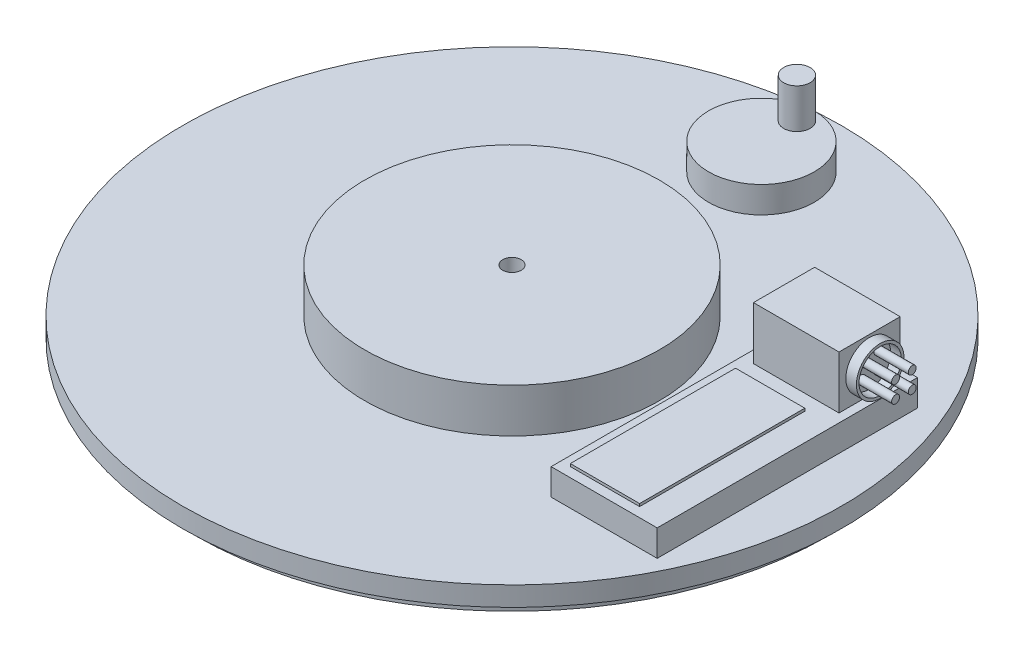
ISO-10303-21;
HEADER;
FILE_DESCRIPTION(('STEP AP214'),'2;1');
FILE_NAME('part.step','',(''),(''),'','','');
FILE_SCHEMA(('AUTOMOTIVE_DESIGN { 1 0 10303 214 1 1 1 1 }'));
ENDSEC;
DATA;
#1=APPLICATION_CONTEXT('core data for automotive mechanical design processes');
#2=APPLICATION_PROTOCOL_DEFINITION('international standard','automotive_design',2000,#1);
#3=PRODUCT_CONTEXT('',#1,'mechanical');
#4=PRODUCT('Part','Part','',(#3));
#5=PRODUCT_RELATED_PRODUCT_CATEGORY('part','',(#4));
#6=PRODUCT_DEFINITION_FORMATION('','',#4);
#7=PRODUCT_DEFINITION_CONTEXT('part definition',#1,'design');
#8=PRODUCT_DEFINITION('design','',#6,#7);
#9=PRODUCT_DEFINITION_SHAPE('','',#8);
#10=(LENGTH_UNIT() NAMED_UNIT(*) SI_UNIT(.MILLI.,.METRE.));
#11=(NAMED_UNIT(*) PLANE_ANGLE_UNIT() SI_UNIT($,.RADIAN.));
#12=(NAMED_UNIT(*) SI_UNIT($,.STERADIAN.) SOLID_ANGLE_UNIT());
#13=UNCERTAINTY_MEASURE_WITH_UNIT(LENGTH_MEASURE(1.E-05),#10,'distance_accuracy_value','');
#14=(GEOMETRIC_REPRESENTATION_CONTEXT(3) GLOBAL_UNCERTAINTY_ASSIGNED_CONTEXT((#13)) GLOBAL_UNIT_ASSIGNED_CONTEXT((#10,
#11,#12)) REPRESENTATION_CONTEXT('',''));
#15=CARTESIAN_POINT('',(0.,0.,0.));
#16=DIRECTION('',(0.,0.,1.));
#17=DIRECTION('',(1.,0.,0.));
#18=AXIS2_PLACEMENT_3D('',#15,#16,#17);
#19=CARTESIAN_POINT('',(0.,22.3181818181822,0.));
#20=DIRECTION('',(0.,1.,0.));
#21=DIRECTION('',(0.,0.,1.));
#22=AXIS2_PLACEMENT_3D('',#19,#20,#21);
#23=PLANE('',#22);
#24=DIRECTION('',(0.,0.,-1.));
#25=VECTOR('',#24,1.);
#26=CARTESIAN_POINT('',(96.6696158483842,22.3181818181822,-14.1507281077167));
#27=LINE('',#26,#25);
#28=CARTESIAN_POINT('',(96.6696158483842,22.318181818182,48.374346745682));
#29=VERTEX_POINT('',#28);
#30=CARTESIAN_POINT('',(96.6696158483842,22.3181818181822,-14.1507281077167));
#31=VERTEX_POINT('',#30);
#32=EDGE_CURVE('E65',#29,#31,#27,.T.);
#33=ORIENTED_EDGE('',*,*,#32,.F.);
#34=DIRECTION('',(1.,0.,0.));
#35=VECTOR('',#34,1.);
#36=CARTESIAN_POINT('',(70.4399255006626,22.318181818182,48.374346745682));
#37=LINE('',#36,#35);
#38=CARTESIAN_POINT('',(70.4399255006626,22.318181818182,48.374346745682));
#39=VERTEX_POINT('',#38);
#40=EDGE_CURVE('E177',#39,#29,#37,.T.);
#41=ORIENTED_EDGE('',*,*,#40,.F.);
#42=DIRECTION('',(0.,0.,1.));
#43=VECTOR('',#42,1.);
#44=CARTESIAN_POINT('',(70.4399255006626,22.3181818181822,-14.1507281077167));
#45=LINE('',#44,#43);
#46=CARTESIAN_POINT('',(70.4399255006626,22.3181818181822,-14.1507281077167));
#47=VERTEX_POINT('',#46);
#48=EDGE_CURVE('E193',#47,#39,#45,.T.);
#49=ORIENTED_EDGE('',*,*,#48,.F.);
#50=DIRECTION('',(-1.,0.,0.));
#51=VECTOR('',#50,1.);
#52=CARTESIAN_POINT('',(70.4399255006626,22.3181818181822,-14.1507281077167));
#53=LINE('',#52,#51);
#54=EDGE_CURVE('E189',#31,#47,#53,.T.);
#55=ORIENTED_EDGE('',*,*,#54,.F.);
#56=EDGE_LOOP('',(#33,#41,#49,#55));
#57=FACE_BOUND('',#56,.T.);
#58=DIRECTION('',(0.,0.,-1.));
#59=VECTOR('',#58,1.);
#60=CARTESIAN_POINT('',(106.964296558477,22.3181818181823,-46.4922962412813));
#61=LINE('',#60,#59);
#62=CARTESIAN_POINT('',(106.964296558477,22.318181818182,52.0183840799977));
#63=VERTEX_POINT('',#62);
#64=CARTESIAN_POINT('',(106.964296558477,22.3181818181823,-46.4922962412813));
#65=VERTEX_POINT('',#64);
#66=EDGE_CURVE('E215',#63,#65,#61,.T.);
#67=ORIENTED_EDGE('',*,*,#66,.T.);
#68=DIRECTION('',(-1.,0.,0.));
#69=VECTOR('',#68,1.);
#70=CARTESIAN_POINT('',(66.8303156868449,22.3181818181823,-46.4922962412813));
#71=LINE('',#70,#69);
#72=CARTESIAN_POINT('',(66.8303156868449,22.3181818181823,-46.4922962412813));
#73=VERTEX_POINT('',#72);
#74=EDGE_CURVE('E219',#65,#73,#71,.T.);
#75=ORIENTED_EDGE('',*,*,#74,.T.);
#76=DIRECTION('',(0.,0.,1.));
#77=VECTOR('',#76,1.);
#78=CARTESIAN_POINT('',(66.8303156868449,22.3181818181823,-46.4922962412813));
#79=LINE('',#78,#77);
#80=CARTESIAN_POINT('',(66.8303156868449,22.318181818182,52.0183840799977));
#81=VERTEX_POINT('',#80);
#82=EDGE_CURVE('E223',#73,#81,#79,.T.);
#83=ORIENTED_EDGE('',*,*,#82,.T.);
#84=DIRECTION('',(1.,0.,0.));
#85=VECTOR('',#84,1.);
#86=CARTESIAN_POINT('',(66.8303156868449,22.318181818182,52.0183840799977));
#87=LINE('',#86,#85);
#88=EDGE_CURVE('E226',#81,#63,#87,.T.);
#89=ORIENTED_EDGE('',*,*,#88,.T.);
#90=EDGE_LOOP('',(#67,#75,#83,#89));
#91=FACE_BOUND('',#90,.T.);
#92=DIRECTION('',(-1.,0.,0.));
#93=VECTOR('',#92,1.);
#94=CARTESIAN_POINT('',(71.3438523796859,22.3181818181823,-43.1937672662138));
#95=LINE('',#94,#93);
#96=CARTESIAN_POINT('',(103.722139149679,22.3181818181823,-43.1937672662138));
#97=VERTEX_POINT('',#96);
#98=CARTESIAN_POINT('',(71.3438523796859,22.3181818181823,-43.1937672662138));
#99=VERTEX_POINT('',#98);
#100=EDGE_CURVE('E370',#97,#99,#95,.T.);
#101=ORIENTED_EDGE('',*,*,#100,.F.);
#102=DIRECTION('',(0.,0.,-1.));
#103=VECTOR('',#102,1.);
#104=CARTESIAN_POINT('',(103.722139149679,22.3181818181823,-43.1937672662138));
#105=LINE('',#104,#103);
#106=CARTESIAN_POINT('',(103.722139149679,22.3181818181822,-20.0342982571218));
#107=VERTEX_POINT('',#106);
#108=EDGE_CURVE('E156',#107,#97,#105,.T.);
#109=ORIENTED_EDGE('',*,*,#108,.F.);
#110=DIRECTION('',(1.,0.,0.));
#111=VECTOR('',#110,1.);
#112=CARTESIAN_POINT('',(71.3438523796859,22.3181818181822,-20.0342982571218));
#113=LINE('',#112,#111);
#114=CARTESIAN_POINT('',(71.3438523796859,22.3181818181822,-20.0342982571218));
#115=VERTEX_POINT('',#114);
#116=EDGE_CURVE('E152',#115,#107,#113,.T.);
#117=ORIENTED_EDGE('',*,*,#116,.F.);
#118=DIRECTION('',(0.,0.,1.));
#119=VECTOR('',#118,1.);
#120=CARTESIAN_POINT('',(71.3438523796859,22.3181818181823,-43.1937672662138));
#121=LINE('',#120,#119);
#122=EDGE_CURVE('E373',#99,#115,#121,.T.);
#123=ORIENTED_EDGE('',*,*,#122,.F.);
#124=EDGE_LOOP('',(#101,#109,#117,#123));
#125=FACE_BOUND('',#124,.T.);
#126=ADVANCED_FACE('F41',(#57,#91,#125),#23,.T.);
#127=CARTESIAN_POINT('',(0.,12.318181818182,55.7328464546199));
#128=DIRECTION('',(0.,-1.,0.));
#129=DIRECTION('',(0.,0.,-1.));
#130=AXIS2_PLACEMENT_3D('',#127,#128,#129);
#131=PLANE('',#130);
#132=CARTESIAN_POINT('',(0.,12.3181818181821,0.));
#133=DIRECTION('',(0.,-1.,0.));
#134=DIRECTION('',(0.,0.,-1.));
#135=AXIS2_PLACEMENT_3D('',#132,#133,#134);
#136=CIRCLE('',#135,55.7328464546199);
#137=CARTESIAN_POINT('',(0.,12.3181818181823,-55.7328464546198));
#138=VERTEX_POINT('',#137);
#139=EDGE_CURVE('E267',#138,#138,#136,.T.);
#140=ORIENTED_EDGE('',*,*,#139,.T.);
#141=EDGE_LOOP('',(#140));
#142=FACE_BOUND('',#141,.T.);
#143=CARTESIAN_POINT('',(0.,12.3181818181823,0.));
#144=DIRECTION('',(0.,-1.,0.));
#145=DIRECTION('',(0.,0.,-1.));
#146=AXIS2_PLACEMENT_3D('',#143,#144,#145);
#147=CIRCLE('',#146,124.727272727273);
#148=CARTESIAN_POINT('',(0.,12.3181818181828,-124.727272727273));
#149=VERTEX_POINT('',#148);
#150=EDGE_CURVE('E263',#149,#149,#147,.T.);
#151=ORIENTED_EDGE('',*,*,#150,.F.);
#152=EDGE_LOOP('',(#151));
#153=FACE_BOUND('',#152,.T.);
#154=CARTESIAN_POINT('',(0.,12.3181818181825,-94.391996496617));
#155=DIRECTION('',(0.,-1.,0.));
#156=DIRECTION('',(0.,0.,-1.));
#157=AXIS2_PLACEMENT_3D('',#154,#155,#156);
#158=CIRCLE('',#157,20.);
#159=CARTESIAN_POINT('',(0.,12.3181818181825,-114.391996496617));
#160=VERTEX_POINT('',#159);
#161=EDGE_CURVE('E311',#160,#160,#158,.F.);
#162=ORIENTED_EDGE('',*,*,#161,.F.);
#163=EDGE_LOOP('',(#162));
#164=FACE_BOUND('',#163,.T.);
#165=DIRECTION('',(0.,0.,-1.));
#166=VECTOR('',#165,1.);
#167=CARTESIAN_POINT('',(106.964296558477,12.3181818181823,-46.4922962412813));
#168=LINE('',#167,#166);
#169=CARTESIAN_POINT('',(106.964296558477,12.318181818182,52.0183840799977));
#170=VERTEX_POINT('',#169);
#171=CARTESIAN_POINT('',(106.964296558477,12.3181818181823,-46.4922962412813));
#172=VERTEX_POINT('',#171);
#173=EDGE_CURVE('E214',#170,#172,#168,.T.);
#174=ORIENTED_EDGE('',*,*,#173,.F.);
#175=DIRECTION('',(1.,0.,0.));
#176=VECTOR('',#175,1.);
#177=CARTESIAN_POINT('',(66.8303156868449,12.318181818182,52.0183840799977));
#178=LINE('',#177,#176);
#179=CARTESIAN_POINT('',(66.8303156868449,12.318181818182,52.0183840799977));
#180=VERTEX_POINT('',#179);
#181=EDGE_CURVE('E220',#180,#170,#178,.T.);
#182=ORIENTED_EDGE('',*,*,#181,.F.);
#183=DIRECTION('',(0.,0.,1.));
#184=VECTOR('',#183,1.);
#185=CARTESIAN_POINT('',(66.8303156868449,12.3181818181823,-46.4922962412813));
#186=LINE('',#185,#184);
#187=CARTESIAN_POINT('',(66.8303156868449,12.3181818181823,-46.4922962412813));
#188=VERTEX_POINT('',#187);
#189=EDGE_CURVE('E237',#188,#180,#186,.T.);
#190=ORIENTED_EDGE('',*,*,#189,.F.);
#191=DIRECTION('',(-1.,0.,0.));
#192=VECTOR('',#191,1.);
#193=CARTESIAN_POINT('',(66.8303156868449,12.3181818181823,-46.4922962412813));
#194=LINE('',#193,#192);
#195=EDGE_CURVE('E233',#172,#188,#194,.T.);
#196=ORIENTED_EDGE('',*,*,#195,.F.);
#197=EDGE_LOOP('',(#174,#182,#190,#196));
#198=FACE_BOUND('',#197,.T.);
#199=ADVANCED_FACE('F396',(#142,#153,#164,#198),#131,.F.);
#200=CARTESIAN_POINT('',(0.,-1000.,-3.43024899888577E-12));
#201=DIRECTION('',(0.,-1.,0.));
#202=DIRECTION('',(0.,0.,-1.));
#203=AXIS2_PLACEMENT_3D('',#200,#201,#202);
#204=CYLINDRICAL_SURFACE('',#203,124.727272727273);
#205=CARTESIAN_POINT('',(0.,4.92975372732007,0.));
#206=DIRECTION('',(0.,-1.,0.));
#207=DIRECTION('',(0.,0.,-1.));
#208=AXIS2_PLACEMENT_3D('',#205,#206,#207);
#209=CIRCLE('',#208,124.727272727273);
#210=CARTESIAN_POINT('',(0.,4.9297537273205,-124.727272727273));
#211=VERTEX_POINT('',#210);
#212=EDGE_CURVE('E307',#211,#211,#209,.T.);
#213=ORIENTED_EDGE('',*,*,#212,.F.);
#214=EDGE_LOOP('',(#213));
#215=FACE_BOUND('',#214,.T.);
#216=ORIENTED_EDGE('',*,*,#150,.T.);
#217=EDGE_LOOP('',(#216));
#218=FACE_BOUND('',#217,.T.);
#219=ADVANCED_FACE('F43',(#215,#218),#204,.T.);
#220=CARTESIAN_POINT('',(0.,4.92975372731966,124.727272727273));
#221=DIRECTION('',(0.,1.,0.));
#222=DIRECTION('',(0.,0.,1.));
#223=AXIS2_PLACEMENT_3D('',#220,#221,#222);
#224=PLANE('',#223);
#225=CARTESIAN_POINT('',(0.,4.92975372732007,0.));
#226=DIRECTION('',(0.,-1.,0.));
#227=DIRECTION('',(0.,0.,-1.));
#228=AXIS2_PLACEMENT_3D('',#225,#226,#227);
#229=CIRCLE('',#228,120.);
#230=CARTESIAN_POINT('',(0.,4.92975372732049,-120.));
#231=VERTEX_POINT('',#230);
#232=EDGE_CURVE('E303',#231,#231,#229,.T.);
#233=ORIENTED_EDGE('',*,*,#232,.F.);
#234=EDGE_LOOP('',(#233));
#235=FACE_BOUND('',#234,.T.);
#236=ORIENTED_EDGE('',*,*,#212,.T.);
#237=EDGE_LOOP('',(#236));
#238=FACE_BOUND('',#237,.T.);
#239=ADVANCED_FACE('F466',(#235,#238),#224,.F.);
#240=CARTESIAN_POINT('',(0.,-1000.,-3.43024899888577E-12));
#241=DIRECTION('',(0.,-1.,0.));
#242=DIRECTION('',(0.,0.,-1.));
#243=AXIS2_PLACEMENT_3D('',#240,#241,#242);
#244=CYLINDRICAL_SURFACE('',#243,120.);
#245=CARTESIAN_POINT('',(0.,0.318181818182328,0.));
#246=DIRECTION('',(0.,-1.,0.));
#247=DIRECTION('',(0.,0.,-1.));
#248=AXIS2_PLACEMENT_3D('',#245,#246,#247);
#249=CIRCLE('',#248,120.);
#250=CARTESIAN_POINT('',(0.,0.31818181818274,-120.));
#251=VERTEX_POINT('',#250);
#252=EDGE_CURVE('E299',#251,#251,#249,.T.);
#253=ORIENTED_EDGE('',*,*,#252,.F.);
#254=EDGE_LOOP('',(#253));
#255=FACE_BOUND('',#254,.T.);
#256=ORIENTED_EDGE('',*,*,#232,.T.);
#257=EDGE_LOOP('',(#256));
#258=FACE_BOUND('',#257,.T.);
#259=ADVANCED_FACE('F463',(#255,#258),#244,.T.);
#260=CARTESIAN_POINT('',(0.,0.318181818181735,120.));
#261=DIRECTION('',(0.,1.,0.));
#262=DIRECTION('',(0.,0.,1.));
#263=AXIS2_PLACEMENT_3D('',#260,#261,#262);
#264=PLANE('',#263);
#265=CARTESIAN_POINT('',(0.,0.318181818182106,0.));
#266=DIRECTION('',(0.,-1.,0.));
#267=DIRECTION('',(0.,0.,-1.));
#268=AXIS2_PLACEMENT_3D('',#265,#266,#267);
#269=CIRCLE('',#268,52.5);
#270=CARTESIAN_POINT('',(0.,0.318181818182286,-52.5));
#271=VERTEX_POINT('',#270);
#272=EDGE_CURVE('E295',#271,#271,#269,.T.);
#273=ORIENTED_EDGE('',*,*,#272,.F.);
#274=EDGE_LOOP('',(#273));
#275=FACE_BOUND('',#274,.T.);
#276=ORIENTED_EDGE('',*,*,#252,.T.);
#277=EDGE_LOOP('',(#276));
#278=FACE_BOUND('',#277,.T.);
#279=ADVANCED_FACE('F459',(#275,#278),#264,.F.);
#280=CARTESIAN_POINT('',(0.,-1000.,-3.43024899888577E-12));
#281=DIRECTION('',(0.,-1.,0.));
#282=DIRECTION('',(0.,0.,-1.));
#283=AXIS2_PLACEMENT_3D('',#280,#281,#282);
#284=CYLINDRICAL_SURFACE('',#283,52.5);
#285=CARTESIAN_POINT('',(0.,4.92975372731985,0.));
#286=DIRECTION('',(0.,-1.,0.));
#287=DIRECTION('',(0.,0.,-1.));
#288=AXIS2_PLACEMENT_3D('',#285,#286,#287);
#289=CIRCLE('',#288,52.5);
#290=CARTESIAN_POINT('',(0.,4.92975372732003,-52.5));
#291=VERTEX_POINT('',#290);
#292=EDGE_CURVE('E291',#291,#291,#289,.T.);
#293=ORIENTED_EDGE('',*,*,#292,.F.);
#294=EDGE_LOOP('',(#293));
#295=FACE_BOUND('',#294,.T.);
#296=ORIENTED_EDGE('',*,*,#272,.T.);
#297=EDGE_LOOP('',(#296));
#298=FACE_BOUND('',#297,.T.);
#299=ADVANCED_FACE('F455',(#295,#298),#284,.F.);
#300=CARTESIAN_POINT('',(0.,4.92975372731966,52.5));
#301=DIRECTION('',(0.,1.,0.));
#302=DIRECTION('',(0.,0.,1.));
#303=AXIS2_PLACEMENT_3D('',#300,#301,#302);
#304=PLANE('',#303);
#305=CARTESIAN_POINT('',(0.,4.92975372731985,0.));
#306=DIRECTION('',(0.,-1.,0.));
#307=DIRECTION('',(0.,0.,-1.));
#308=AXIS2_PLACEMENT_3D('',#305,#306,#307);
#309=CIRCLE('',#308,50.5);
#310=CARTESIAN_POINT('',(0.,4.92975372732003,-50.5));
#311=VERTEX_POINT('',#310);
#312=EDGE_CURVE('E287',#311,#311,#309,.T.);
#313=ORIENTED_EDGE('',*,*,#312,.F.);
#314=EDGE_LOOP('',(#313));
#315=FACE_BOUND('',#314,.T.);
#316=ORIENTED_EDGE('',*,*,#292,.T.);
#317=EDGE_LOOP('',(#316));
#318=FACE_BOUND('',#317,.T.);
#319=ADVANCED_FACE('F451',(#315,#318),#304,.F.);
#320=CARTESIAN_POINT('',(0.,-1000.,-3.43024899888577E-12));
#321=DIRECTION('',(0.,-1.,0.));
#322=DIRECTION('',(0.,0.,-1.));
#323=AXIS2_PLACEMENT_3D('',#320,#321,#322);
#324=CYLINDRICAL_SURFACE('',#323,50.4999999999999);
#325=CARTESIAN_POINT('',(0.,22.6516709545139,0.));
#326=DIRECTION('',(0.,-1.,0.));
#327=DIRECTION('',(0.,0.,-1.));
#328=AXIS2_PLACEMENT_3D('',#325,#326,#327);
#329=CIRCLE('',#328,50.4999999999999);
#330=CARTESIAN_POINT('',(0.,22.6516709545141,-50.4999999999998));
#331=VERTEX_POINT('',#330);
#332=EDGE_CURVE('E283',#331,#331,#329,.T.);
#333=ORIENTED_EDGE('',*,*,#332,.F.);
#334=EDGE_LOOP('',(#333));
#335=FACE_BOUND('',#334,.T.);
#336=ORIENTED_EDGE('',*,*,#312,.T.);
#337=EDGE_LOOP('',(#336));
#338=FACE_BOUND('',#337,.T.);
#339=ADVANCED_FACE('F447',(#335,#338),#324,.F.);
#340=CARTESIAN_POINT('',(0.,22.6516709545137,50.5));
#341=DIRECTION('',(0.,1.,0.));
#342=DIRECTION('',(0.,0.,1.));
#343=AXIS2_PLACEMENT_3D('',#340,#341,#342);
#344=PLANE('',#343);
#345=CARTESIAN_POINT('',(0.,22.6516709545137,0.));
#346=DIRECTION('',(0.,-1.,0.));
#347=DIRECTION('',(0.,0.,-1.));
#348=AXIS2_PLACEMENT_3D('',#345,#346,#347);
#349=CIRCLE('',#348,3.49999999999993);
#350=CARTESIAN_POINT('',(0.,22.6516709545137,-3.49999999999985));
#351=VERTEX_POINT('',#350);
#352=EDGE_CURVE('E279',#351,#351,#349,.T.);
#353=ORIENTED_EDGE('',*,*,#352,.F.);
#354=EDGE_LOOP('',(#353));
#355=FACE_BOUND('',#354,.T.);
#356=ORIENTED_EDGE('',*,*,#332,.T.);
#357=EDGE_LOOP('',(#356));
#358=FACE_BOUND('',#357,.T.);
#359=ADVANCED_FACE('F443',(#355,#358),#344,.F.);
#360=CARTESIAN_POINT('',(0.,-1000.,-3.43024899888577E-12));
#361=DIRECTION('',(0.,-1.,0.));
#362=DIRECTION('',(0.,0.,-1.));
#363=AXIS2_PLACEMENT_3D('',#360,#361,#362);
#364=CYLINDRICAL_SURFACE('',#363,3.49999999999991);
#365=CARTESIAN_POINT('',(0.,28.9964360744497,0.));
#366=DIRECTION('',(0.,-1.,0.));
#367=DIRECTION('',(0.,0.,-1.));
#368=AXIS2_PLACEMENT_3D('',#365,#366,#367);
#369=CIRCLE('',#368,3.4999999999999);
#370=CARTESIAN_POINT('',(0.,28.9964360744497,-3.4999999999998));
#371=VERTEX_POINT('',#370);
#372=EDGE_CURVE('E275',#371,#371,#369,.T.);
#373=ORIENTED_EDGE('',*,*,#372,.F.);
#374=EDGE_LOOP('',(#373));
#375=FACE_BOUND('',#374,.T.);
#376=ORIENTED_EDGE('',*,*,#352,.T.);
#377=EDGE_LOOP('',(#376));
#378=FACE_BOUND('',#377,.T.);
#379=ADVANCED_FACE('F439',(#375,#378),#364,.F.);
#380=CARTESIAN_POINT('',(0.,28.9964360744497,50.5));
#381=DIRECTION('',(0.,-1.,0.));
#382=DIRECTION('',(0.,0.,-1.));
#383=AXIS2_PLACEMENT_3D('',#380,#381,#382);
#384=PLANE('',#383);
#385=CARTESIAN_POINT('',(0.,28.9964360744499,0.));
#386=DIRECTION('',(0.,-1.,0.));
#387=DIRECTION('',(0.,0.,-1.));
#388=AXIS2_PLACEMENT_3D('',#385,#386,#387);
#389=CIRCLE('',#388,55.7328464546198);
#390=CARTESIAN_POINT('',(0.,28.9964360744501,-55.7328464546197));
#391=VERTEX_POINT('',#390);
#392=EDGE_CURVE('E271',#391,#391,#389,.T.);
#393=ORIENTED_EDGE('',*,*,#392,.F.);
#394=EDGE_LOOP('',(#393));
#395=FACE_BOUND('',#394,.T.);
#396=ORIENTED_EDGE('',*,*,#372,.T.);
#397=EDGE_LOOP('',(#396));
#398=FACE_BOUND('',#397,.T.);
#399=ADVANCED_FACE('F435',(#395,#398),#384,.F.);
#400=CARTESIAN_POINT('',(0.,-1000.,-3.43024899888577E-12));
#401=DIRECTION('',(0.,-1.,0.));
#402=DIRECTION('',(0.,0.,-1.));
#403=AXIS2_PLACEMENT_3D('',#400,#401,#402);
#404=CYLINDRICAL_SURFACE('',#403,55.7328464546198);
#405=ORIENTED_EDGE('',*,*,#139,.F.);
#406=EDGE_LOOP('',(#405));
#407=FACE_BOUND('',#406,.T.);
#408=ORIENTED_EDGE('',*,*,#392,.T.);
#409=EDGE_LOOP('',(#408));
#410=FACE_BOUND('',#409,.T.);
#411=ADVANCED_FACE('F430',(#407,#410),#404,.T.);
#412=CARTESIAN_POINT('',(0.,22.3181818181825,-94.3919964966169));
#413=DIRECTION('',(0.,-1.,0.));
#414=DIRECTION('',(0.,0.,-1.));
#415=AXIS2_PLACEMENT_3D('',#412,#413,#414);
#416=CYLINDRICAL_SURFACE('',#415,20.);
#417=CARTESIAN_POINT('',(0.,22.3181818181825,-94.3919964966169));
#418=DIRECTION('',(0.,1.,0.));
#419=DIRECTION('',(0.,0.,1.));
#420=AXIS2_PLACEMENT_3D('',#417,#418,#419);
#421=CIRCLE('',#420,20.);
#422=CARTESIAN_POINT('',(0.,22.3181818181824,-74.3919964966169));
#423=VERTEX_POINT('',#422);
#424=EDGE_CURVE('E259',#423,#423,#421,.T.);
#425=ORIENTED_EDGE('',*,*,#424,.F.);
#426=EDGE_LOOP('',(#425));
#427=FACE_BOUND('',#426,.T.);
#428=ORIENTED_EDGE('',*,*,#161,.T.);
#429=EDGE_LOOP('',(#428));
#430=FACE_BOUND('',#429,.T.);
#431=ADVANCED_FACE('F427',(#427,#430),#416,.T.);
#432=CARTESIAN_POINT('',(0.,22.3181818181825,-94.3919964966169));
#433=DIRECTION('',(0.,1.,0.));
#434=DIRECTION('',(0.,0.,1.));
#435=AXIS2_PLACEMENT_3D('',#432,#433,#434);
#436=PLANE('',#435);
#437=CARTESIAN_POINT('',(0.,22.3181818181825,-107.82749510204));
#438=DIRECTION('',(0.,1.,0.));
#439=DIRECTION('',(0.,0.,1.));
#440=AXIS2_PLACEMENT_3D('',#437,#438,#439);
#441=CIRCLE('',#440,5.);
#442=CARTESIAN_POINT('',(0.,22.3181818181825,-102.82749510204));
#443=VERTEX_POINT('',#442);
#444=EDGE_CURVE('E159',#443,#443,#441,.T.);
#445=ORIENTED_EDGE('',*,*,#444,.F.);
#446=EDGE_LOOP('',(#445));
#447=FACE_BOUND('',#446,.T.);
#448=ORIENTED_EDGE('',*,*,#424,.T.);
#449=EDGE_LOOP('',(#448));
#450=FACE_BOUND('',#449,.T.);
#451=ADVANCED_FACE('F423',(#447,#450),#436,.T.);
#452=CARTESIAN_POINT('',(106.964296558477,22.3181818181823,-46.4922962412813));
#453=DIRECTION('',(-1.,0.,0.));
#454=DIRECTION('',(0.,0.,1.));
#455=AXIS2_PLACEMENT_3D('',#452,#453,#454);
#456=PLANE('',#455);
#457=ORIENTED_EDGE('',*,*,#173,.T.);
#458=DIRECTION('',(0.,-1.,0.));
#459=VECTOR('',#458,1.);
#460=CARTESIAN_POINT('',(106.964296558477,22.3181818181823,-46.4922962412813));
#461=LINE('',#460,#459);
#462=EDGE_CURVE('E255',#65,#172,#461,.T.);
#463=ORIENTED_EDGE('',*,*,#462,.F.);
#464=ORIENTED_EDGE('',*,*,#66,.F.);
#465=DIRECTION('',(0.,-1.,0.));
#466=VECTOR('',#465,1.);
#467=CARTESIAN_POINT('',(106.964296558477,22.318181818182,52.0183840799977));
#468=LINE('',#467,#466);
#469=EDGE_CURVE('E229',#63,#170,#468,.T.);
#470=ORIENTED_EDGE('',*,*,#469,.T.);
#471=EDGE_LOOP('',(#457,#463,#464,#470));
#472=FACE_BOUND('',#471,.T.);
#473=ADVANCED_FACE('F419',(#472),#456,.F.);
#474=CARTESIAN_POINT('',(66.8303156868449,22.3181818181823,-46.4922962412813));
#475=DIRECTION('',(0.,0.,1.));
#476=DIRECTION('',(0.,-1.,0.));
#477=AXIS2_PLACEMENT_3D('',#474,#475,#476);
#478=PLANE('',#477);
#479=ORIENTED_EDGE('',*,*,#195,.T.);
#480=DIRECTION('',(0.,-1.,0.));
#481=VECTOR('',#480,1.);
#482=CARTESIAN_POINT('',(66.8303156868449,22.3181818181823,-46.4922962412813));
#483=LINE('',#482,#481);
#484=EDGE_CURVE('E251',#73,#188,#483,.T.);
#485=ORIENTED_EDGE('',*,*,#484,.F.);
#486=ORIENTED_EDGE('',*,*,#74,.F.);
#487=ORIENTED_EDGE('',*,*,#462,.T.);
#488=EDGE_LOOP('',(#479,#485,#486,#487));
#489=FACE_BOUND('',#488,.T.);
#490=ADVANCED_FACE('F415',(#489),#478,.F.);
#491=CARTESIAN_POINT('',(66.8303156868449,22.3181818181823,-46.4922962412813));
#492=DIRECTION('',(1.,0.,0.));
#493=DIRECTION('',(0.,0.,-1.));
#494=AXIS2_PLACEMENT_3D('',#491,#492,#493);
#495=PLANE('',#494);
#496=ORIENTED_EDGE('',*,*,#189,.T.);
#497=DIRECTION('',(0.,-1.,0.));
#498=VECTOR('',#497,1.);
#499=CARTESIAN_POINT('',(66.8303156868449,22.318181818182,52.0183840799977));
#500=LINE('',#499,#498);
#501=EDGE_CURVE('E247',#81,#180,#500,.T.);
#502=ORIENTED_EDGE('',*,*,#501,.F.);
#503=ORIENTED_EDGE('',*,*,#82,.F.);
#504=ORIENTED_EDGE('',*,*,#484,.T.);
#505=EDGE_LOOP('',(#496,#502,#503,#504));
#506=FACE_BOUND('',#505,.T.);
#507=ADVANCED_FACE('F411',(#506),#495,.F.);
#508=CARTESIAN_POINT('',(66.8303156868449,22.318181818182,52.0183840799977));
#509=DIRECTION('',(0.,0.,-1.));
#510=DIRECTION('',(0.,1.,0.));
#511=AXIS2_PLACEMENT_3D('',#508,#509,#510);
#512=PLANE('',#511);
#513=ORIENTED_EDGE('',*,*,#181,.T.);
#514=ORIENTED_EDGE('',*,*,#469,.F.);
#515=ORIENTED_EDGE('',*,*,#88,.F.);
#516=ORIENTED_EDGE('',*,*,#501,.T.);
#517=EDGE_LOOP('',(#513,#514,#515,#516));
#518=FACE_BOUND('',#517,.T.);
#519=ADVANCED_FACE('F408',(#518),#512,.F.);
#520=CARTESIAN_POINT('',(96.6696158483842,23.3181818181822,-14.1507281077167));
#521=DIRECTION('',(-1.,0.,0.));
#522=DIRECTION('',(0.,0.,1.));
#523=AXIS2_PLACEMENT_3D('',#520,#521,#522);
#524=PLANE('',#523);
#525=ORIENTED_EDGE('',*,*,#32,.T.);
#526=DIRECTION('',(0.,-1.,0.));
#527=VECTOR('',#526,1.);
#528=CARTESIAN_POINT('',(96.6696158483842,23.3181818181822,-14.1507281077167));
#529=LINE('',#528,#527);
#530=CARTESIAN_POINT('',(96.6696158483842,23.3181818181822,-14.1507281077167));
#531=VERTEX_POINT('',#530);
#532=EDGE_CURVE('E210',#531,#31,#529,.T.);
#533=ORIENTED_EDGE('',*,*,#532,.F.);
#534=DIRECTION('',(0.,0.,-1.));
#535=VECTOR('',#534,1.);
#536=CARTESIAN_POINT('',(96.6696158483842,23.3181818181822,-14.1507281077167));
#537=LINE('',#536,#535);
#538=CARTESIAN_POINT('',(96.6696158483842,23.318181818182,48.374346745682));
#539=VERTEX_POINT('',#538);
#540=EDGE_CURVE('E172',#539,#531,#537,.T.);
#541=ORIENTED_EDGE('',*,*,#540,.F.);
#542=DIRECTION('',(0.,-1.,0.));
#543=VECTOR('',#542,1.);
#544=CARTESIAN_POINT('',(96.6696158483842,23.318181818182,48.374346745682));
#545=LINE('',#544,#543);
#546=EDGE_CURVE('E186',#539,#29,#545,.T.);
#547=ORIENTED_EDGE('',*,*,#546,.T.);
#548=EDGE_LOOP('',(#525,#533,#541,#547));
#549=FACE_BOUND('',#548,.T.);
#550=ADVANCED_FACE('F406',(#549),#524,.F.);
#551=CARTESIAN_POINT('',(70.4399255006626,23.3181818181822,-14.1507281077167));
#552=DIRECTION('',(0.,0.,1.));
#553=DIRECTION('',(0.,-1.,0.));
#554=AXIS2_PLACEMENT_3D('',#551,#552,#553);
#555=PLANE('',#554);
#556=ORIENTED_EDGE('',*,*,#54,.T.);
#557=DIRECTION('',(0.,-1.,0.));
#558=VECTOR('',#557,1.);
#559=CARTESIAN_POINT('',(70.4399255006626,23.3181818181822,-14.1507281077167));
#560=LINE('',#559,#558);
#561=CARTESIAN_POINT('',(70.4399255006626,23.3181818181822,-14.1507281077167));
#562=VERTEX_POINT('',#561);
#563=EDGE_CURVE('E206',#562,#47,#560,.T.);
#564=ORIENTED_EDGE('',*,*,#563,.F.);
#565=DIRECTION('',(-1.,0.,0.));
#566=VECTOR('',#565,1.);
#567=CARTESIAN_POINT('',(70.4399255006626,23.3181818181822,-14.1507281077167));
#568=LINE('',#567,#566);
#569=EDGE_CURVE('E176',#531,#562,#568,.T.);
#570=ORIENTED_EDGE('',*,*,#569,.F.);
#571=ORIENTED_EDGE('',*,*,#532,.T.);
#572=EDGE_LOOP('',(#556,#564,#570,#571));
#573=FACE_BOUND('',#572,.T.);
#574=ADVANCED_FACE('F548',(#573),#555,.F.);
#575=CARTESIAN_POINT('',(70.4399255006626,23.3181818181822,-14.1507281077167));
#576=DIRECTION('',(1.,0.,0.));
#577=DIRECTION('',(0.,0.,-1.));
#578=AXIS2_PLACEMENT_3D('',#575,#576,#577);
#579=PLANE('',#578);
#580=ORIENTED_EDGE('',*,*,#48,.T.);
#581=DIRECTION('',(0.,-1.,0.));
#582=VECTOR('',#581,1.);
#583=CARTESIAN_POINT('',(70.4399255006626,23.318181818182,48.374346745682));
#584=LINE('',#583,#582);
#585=CARTESIAN_POINT('',(70.4399255006626,23.318181818182,48.374346745682));
#586=VERTEX_POINT('',#585);
#587=EDGE_CURVE('E202',#586,#39,#584,.T.);
#588=ORIENTED_EDGE('',*,*,#587,.F.);
#589=DIRECTION('',(0.,0.,1.));
#590=VECTOR('',#589,1.);
#591=CARTESIAN_POINT('',(70.4399255006626,23.3181818181822,-14.1507281077167));
#592=LINE('',#591,#590);
#593=EDGE_CURVE('E180',#562,#586,#592,.T.);
#594=ORIENTED_EDGE('',*,*,#593,.F.);
#595=ORIENTED_EDGE('',*,*,#563,.T.);
#596=EDGE_LOOP('',(#580,#588,#594,#595));
#597=FACE_BOUND('',#596,.T.);
#598=ADVANCED_FACE('F557',(#597),#579,.F.);
#599=CARTESIAN_POINT('',(70.4399255006626,23.318181818182,48.374346745682));
#600=DIRECTION('',(0.,0.,-1.));
#601=DIRECTION('',(0.,1.,0.));
#602=AXIS2_PLACEMENT_3D('',#599,#600,#601);
#603=PLANE('',#602);
#604=ORIENTED_EDGE('',*,*,#40,.T.);
#605=ORIENTED_EDGE('',*,*,#546,.F.);
#606=DIRECTION('',(1.,0.,0.));
#607=VECTOR('',#606,1.);
#608=CARTESIAN_POINT('',(70.4399255006626,23.318181818182,48.374346745682));
#609=LINE('',#608,#607);
#610=EDGE_CURVE('E183',#586,#539,#609,.T.);
#611=ORIENTED_EDGE('',*,*,#610,.F.);
#612=ORIENTED_EDGE('',*,*,#587,.T.);
#613=EDGE_LOOP('',(#604,#605,#611,#612));
#614=FACE_BOUND('',#613,.T.);
#615=ADVANCED_FACE('F566',(#614),#603,.F.);
#616=CARTESIAN_POINT('',(0.,23.3181818181822,0.));
#617=DIRECTION('',(0.,1.,0.));
#618=DIRECTION('',(0.,0.,1.));
#619=AXIS2_PLACEMENT_3D('',#616,#617,#618);
#620=PLANE('',#619);
#621=ORIENTED_EDGE('',*,*,#540,.T.);
#622=ORIENTED_EDGE('',*,*,#569,.T.);
#623=ORIENTED_EDGE('',*,*,#593,.T.);
#624=ORIENTED_EDGE('',*,*,#610,.T.);
#625=EDGE_LOOP('',(#621,#622,#623,#624));
#626=FACE_BOUND('',#625,.T.);
#627=ADVANCED_FACE('F576',(#626),#620,.T.);
#628=CARTESIAN_POINT('',(0.,37.3181818181825,-107.82749510204));
#629=DIRECTION('',(0.,-1.,0.));
#630=DIRECTION('',(0.,0.,-1.));
#631=AXIS2_PLACEMENT_3D('',#628,#629,#630);
#632=CYLINDRICAL_SURFACE('',#631,5.);
#633=CARTESIAN_POINT('',(0.,37.3181818181825,-107.82749510204));
#634=DIRECTION('',(0.,1.,0.));
#635=DIRECTION('',(0.,0.,1.));
#636=AXIS2_PLACEMENT_3D('',#633,#634,#635);
#637=CIRCLE('',#636,5.);
#638=CARTESIAN_POINT('',(0.,37.3181818181825,-102.82749510204));
#639=VERTEX_POINT('',#638);
#640=EDGE_CURVE('E164',#639,#639,#637,.T.);
#641=ORIENTED_EDGE('',*,*,#640,.F.);
#642=EDGE_LOOP('',(#641));
#643=FACE_BOUND('',#642,.T.);
#644=ORIENTED_EDGE('',*,*,#444,.T.);
#645=EDGE_LOOP('',(#644));
#646=FACE_BOUND('',#645,.T.);
#647=ADVANCED_FACE('F586',(#643,#646),#632,.T.);
#648=CARTESIAN_POINT('',(0.,37.3181818181825,-107.82749510204));
#649=DIRECTION('',(0.,1.,0.));
#650=DIRECTION('',(0.,0.,1.));
#651=AXIS2_PLACEMENT_3D('',#648,#649,#650);
#652=PLANE('',#651);
#653=ORIENTED_EDGE('',*,*,#640,.T.);
#654=EDGE_LOOP('',(#653));
#655=FACE_BOUND('',#654,.T.);
#656=ADVANCED_FACE('F603',(#655),#652,.T.);
#657=CARTESIAN_POINT('',(103.722139149679,42.3181818181823,-43.1937672662137));
#658=DIRECTION('',(-1.,0.,0.));
#659=DIRECTION('',(0.,0.,1.));
#660=AXIS2_PLACEMENT_3D('',#657,#658,#659);
#661=PLANE('',#660);
#662=CARTESIAN_POINT('',(103.722139149679,32.3181818181822,-31.6140327616677));
#663=DIRECTION('',(-1.,0.,0.));
#664=DIRECTION('',(0.,0.,1.));
#665=AXIS2_PLACEMENT_3D('',#662,#663,#664);
#666=CIRCLE('',#665,9.);
#667=CARTESIAN_POINT('',(103.722139149679,32.3181818181822,-22.6140327616677));
#668=VERTEX_POINT('',#667);
#669=EDGE_CURVE('E315',#668,#668,#666,.F.);
#670=ORIENTED_EDGE('',*,*,#669,.F.);
#671=EDGE_LOOP('',(#670));
#672=FACE_BOUND('',#671,.T.);
#673=ORIENTED_EDGE('',*,*,#108,.T.);
#674=DIRECTION('',(0.,-1.,0.));
#675=VECTOR('',#674,1.);
#676=CARTESIAN_POINT('',(103.722139149679,42.3181818181823,-43.1937672662137));
#677=LINE('',#676,#675);
#678=CARTESIAN_POINT('',(103.722139149679,42.3181818181823,-43.1937672662137));
#679=VERTEX_POINT('',#678);
#680=EDGE_CURVE('E135',#679,#97,#677,.T.);
#681=ORIENTED_EDGE('',*,*,#680,.F.);
#682=DIRECTION('',(0.,0.,-1.));
#683=VECTOR('',#682,1.);
#684=CARTESIAN_POINT('',(103.722139149679,42.3181818181823,-43.1937672662137));
#685=LINE('',#684,#683);
#686=CARTESIAN_POINT('',(103.722139149679,42.3181818181822,-20.0342982571217));
#687=VERTEX_POINT('',#686);
#688=EDGE_CURVE('E143',#687,#679,#685,.T.);
#689=ORIENTED_EDGE('',*,*,#688,.F.);
#690=DIRECTION('',(0.,-1.,0.));
#691=VECTOR('',#690,1.);
#692=CARTESIAN_POINT('',(103.722139149679,42.3181818181822,-20.0342982571217));
#693=LINE('',#692,#691);
#694=EDGE_CURVE('E367',#687,#107,#693,.T.);
#695=ORIENTED_EDGE('',*,*,#694,.T.);
#696=EDGE_LOOP('',(#673,#681,#689,#695));
#697=FACE_BOUND('',#696,.T.);
#698=ADVANCED_FACE('F154',(#672,#697),#661,.F.);
#699=CARTESIAN_POINT('',(71.3438523796859,42.3181818181823,-43.1937672662137));
#700=DIRECTION('',(0.,0.,1.));
#701=DIRECTION('',(0.,-1.,0.));
#702=AXIS2_PLACEMENT_3D('',#699,#700,#701);
#703=PLANE('',#702);
#704=ORIENTED_EDGE('',*,*,#100,.T.);
#705=DIRECTION('',(0.,-1.,0.));
#706=VECTOR('',#705,1.);
#707=CARTESIAN_POINT('',(71.3438523796859,42.3181818181823,-43.1937672662137));
#708=LINE('',#707,#706);
#709=CARTESIAN_POINT('',(71.3438523796859,42.3181818181823,-43.1937672662137));
#710=VERTEX_POINT('',#709);
#711=EDGE_CURVE('E138',#710,#99,#708,.T.);
#712=ORIENTED_EDGE('',*,*,#711,.F.);
#713=DIRECTION('',(-1.,0.,0.));
#714=VECTOR('',#713,1.);
#715=CARTESIAN_POINT('',(71.3438523796859,42.3181818181823,-43.1937672662137));
#716=LINE('',#715,#714);
#717=EDGE_CURVE('E131',#679,#710,#716,.T.);
#718=ORIENTED_EDGE('',*,*,#717,.F.);
#719=ORIENTED_EDGE('',*,*,#680,.T.);
#720=EDGE_LOOP('',(#704,#712,#718,#719));
#721=FACE_BOUND('',#720,.T.);
#722=ADVANCED_FACE('F133',(#721),#703,.F.);
#723=CARTESIAN_POINT('',(71.3438523796859,42.3181818181823,-43.1937672662137));
#724=DIRECTION('',(1.,0.,0.));
#725=DIRECTION('',(0.,0.,-1.));
#726=AXIS2_PLACEMENT_3D('',#723,#724,#725);
#727=PLANE('',#726);
#728=ORIENTED_EDGE('',*,*,#122,.T.);
#729=DIRECTION('',(0.,-1.,0.));
#730=VECTOR('',#729,1.);
#731=CARTESIAN_POINT('',(71.3438523796859,42.3181818181822,-20.0342982571217));
#732=LINE('',#731,#730);
#733=CARTESIAN_POINT('',(71.3438523796859,42.3181818181822,-20.0342982571217));
#734=VERTEX_POINT('',#733);
#735=EDGE_CURVE('E57',#734,#115,#732,.T.);
#736=ORIENTED_EDGE('',*,*,#735,.F.);
#737=DIRECTION('',(0.,0.,1.));
#738=VECTOR('',#737,1.);
#739=CARTESIAN_POINT('',(71.3438523796859,42.3181818181823,-43.1937672662137));
#740=LINE('',#739,#738);
#741=EDGE_CURVE('E142',#710,#734,#740,.T.);
#742=ORIENTED_EDGE('',*,*,#741,.F.);
#743=ORIENTED_EDGE('',*,*,#711,.T.);
#744=EDGE_LOOP('',(#728,#736,#742,#743));
#745=FACE_BOUND('',#744,.T.);
#746=ADVANCED_FACE('F384',(#745),#727,.F.);
#747=CARTESIAN_POINT('',(71.3438523796859,42.3181818181822,-20.0342982571217));
#748=DIRECTION('',(0.,0.,-1.));
#749=DIRECTION('',(0.,1.,0.));
#750=AXIS2_PLACEMENT_3D('',#747,#748,#749);
#751=PLANE('',#750);
#752=ORIENTED_EDGE('',*,*,#116,.T.);
#753=ORIENTED_EDGE('',*,*,#694,.F.);
#754=DIRECTION('',(1.,0.,0.));
#755=VECTOR('',#754,1.);
#756=CARTESIAN_POINT('',(71.3438523796859,42.3181818181822,-20.0342982571217));
#757=LINE('',#756,#755);
#758=EDGE_CURVE('E147',#734,#687,#757,.T.);
#759=ORIENTED_EDGE('',*,*,#758,.F.);
#760=ORIENTED_EDGE('',*,*,#735,.T.);
#761=EDGE_LOOP('',(#752,#753,#759,#760));
#762=FACE_BOUND('',#761,.T.);
#763=ADVANCED_FACE('F385',(#762),#751,.F.);
#764=CARTESIAN_POINT('',(0.,42.3181818181822,1.45575612763856E-13));
#765=DIRECTION('',(0.,1.,0.));
#766=DIRECTION('',(0.,0.,1.));
#767=AXIS2_PLACEMENT_3D('',#764,#765,#766);
#768=PLANE('',#767);
#769=ORIENTED_EDGE('',*,*,#688,.T.);
#770=ORIENTED_EDGE('',*,*,#717,.T.);
#771=ORIENTED_EDGE('',*,*,#741,.T.);
#772=ORIENTED_EDGE('',*,*,#758,.T.);
#773=EDGE_LOOP('',(#769,#770,#771,#772));
#774=FACE_BOUND('',#773,.T.);
#775=ADVANCED_FACE('F146',(#774),#768,.T.);
#776=CARTESIAN_POINT('',(107.722139149679,32.3181818181822,-31.6140327616677));
#777=DIRECTION('',(1.,0.,0.));
#778=DIRECTION('',(0.,0.,-1.));
#779=AXIS2_PLACEMENT_3D('',#776,#777,#778);
#780=PLANE('',#779);
#781=CARTESIAN_POINT('',(107.722139149679,32.3181818181822,-31.6140327616677));
#782=DIRECTION('',(1.,0.,0.));
#783=DIRECTION('',(0.,0.,-1.));
#784=AXIS2_PLACEMENT_3D('',#781,#782,#783);
#785=CIRCLE('',#784,9.);
#786=CARTESIAN_POINT('',(107.722139149679,32.3181818181822,-40.6140327616677));
#787=VERTEX_POINT('',#786);
#788=EDGE_CURVE('E354',#787,#787,#785,.T.);
#789=ORIENTED_EDGE('',*,*,#788,.T.);
#790=EDGE_LOOP('',(#789));
#791=FACE_BOUND('',#790,.T.);
#792=CARTESIAN_POINT('',(107.722139149679,32.3181818181822,-31.6140327616677));
#793=DIRECTION('',(1.,0.,0.));
#794=DIRECTION('',(0.,0.,-1.));
#795=AXIS2_PLACEMENT_3D('',#792,#793,#794);
#796=CIRCLE('',#795,8.);
#797=CARTESIAN_POINT('',(107.722139149679,32.3181818181822,-39.6140327616677));
#798=VERTEX_POINT('',#797);
#799=EDGE_CURVE('E348',#798,#798,#796,.T.);
#800=ORIENTED_EDGE('',*,*,#799,.F.);
#801=EDGE_LOOP('',(#800));
#802=FACE_BOUND('',#801,.T.);
#803=ADVANCED_FACE('F392',(#791,#802),#780,.T.);
#804=CARTESIAN_POINT('',(107.722139149679,32.3181818181822,-31.6140327616677));
#805=DIRECTION('',(-1.,0.,0.));
#806=DIRECTION('',(0.,0.,1.));
#807=AXIS2_PLACEMENT_3D('',#804,#805,#806);
#808=CYLINDRICAL_SURFACE('',#807,9.);
#809=ORIENTED_EDGE('',*,*,#788,.F.);
#810=EDGE_LOOP('',(#809));
#811=FACE_BOUND('',#810,.T.);
#812=ORIENTED_EDGE('',*,*,#669,.T.);
#813=EDGE_LOOP('',(#812));
#814=FACE_BOUND('',#813,.T.);
#815=ADVANCED_FACE('F662',(#811,#814),#808,.T.);
#816=CARTESIAN_POINT('',(107.722139149679,32.3181818181822,-31.6140327616677));
#817=DIRECTION('',(-1.,0.,0.));
#818=DIRECTION('',(0.,0.,1.));
#819=AXIS2_PLACEMENT_3D('',#816,#817,#818);
#820=CYLINDRICAL_SURFACE('',#819,8.);
#821=ORIENTED_EDGE('',*,*,#799,.T.);
#822=EDGE_LOOP('',(#821));
#823=FACE_BOUND('',#822,.T.);
#824=CARTESIAN_POINT('',(103.722139149679,32.3181818181822,-31.6140327616677));
#825=DIRECTION('',(1.,0.,0.));
#826=DIRECTION('',(0.,0.,-1.));
#827=AXIS2_PLACEMENT_3D('',#824,#825,#826);
#828=CIRCLE('',#827,8.);
#829=CARTESIAN_POINT('',(103.722139149679,32.3181818181822,-39.6140327616677));
#830=VERTEX_POINT('',#829);
#831=EDGE_CURVE('E345',#830,#830,#828,.T.);
#832=ORIENTED_EDGE('',*,*,#831,.F.);
#833=EDGE_LOOP('',(#832));
#834=FACE_BOUND('',#833,.T.);
#835=ADVANCED_FACE('F336',(#823,#834),#820,.F.);
#836=CARTESIAN_POINT('',(103.722139149679,29.1093818302072,-28.4698991714718));
#837=DIRECTION('',(-1.,0.,0.));
#838=DIRECTION('',(0.,0.,1.));
#839=AXIS2_PLACEMENT_3D('',#836,#837,#838);
#840=CIRCLE('',#839,1.50567332509797);
#841=CARTESIAN_POINT('',(103.722139149679,29.1093818302072,-26.9642258463739));
#842=VERTEX_POINT('',#841);
#843=EDGE_CURVE('E11',#842,#842,#840,.F.);
#844=ORIENTED_EDGE('',*,*,#843,.F.);
#845=EDGE_LOOP('',(#844));
#846=FACE_BOUND('',#845,.T.);
#847=CARTESIAN_POINT('',(103.722139149679,29.1093818302072,-34.7581663518636));
#848=DIRECTION('',(-1.,0.,0.));
#849=DIRECTION('',(0.,0.,1.));
#850=AXIS2_PLACEMENT_3D('',#847,#848,#849);
#851=CIRCLE('',#850,1.50567332509797);
#852=CARTESIAN_POINT('',(103.722139149679,29.1093818302072,-33.2524930267657));
#853=VERTEX_POINT('',#852);
#854=EDGE_CURVE('E50',#853,#853,#851,.F.);
#855=ORIENTED_EDGE('',*,*,#854,.F.);
#856=EDGE_LOOP('',(#855));
#857=FACE_BOUND('',#856,.T.);
#858=CARTESIAN_POINT('',(103.722139149679,35.5269818061573,-28.4698991714718));
#859=DIRECTION('',(-1.,0.,0.));
#860=DIRECTION('',(0.,0.,1.));
#861=AXIS2_PLACEMENT_3D('',#858,#859,#860);
#862=CIRCLE('',#861,1.50567332509797);
#863=CARTESIAN_POINT('',(103.722139149679,35.5269818061573,-26.9642258463739));
#864=VERTEX_POINT('',#863);
#865=EDGE_CURVE('E323',#864,#864,#862,.F.);
#866=ORIENTED_EDGE('',*,*,#865,.F.);
#867=EDGE_LOOP('',(#866));
#868=FACE_BOUND('',#867,.T.);
#869=CARTESIAN_POINT('',(103.722139149679,35.5269818061573,-34.7581663518636));
#870=DIRECTION('',(-1.,0.,0.));
#871=DIRECTION('',(0.,0.,1.));
#872=AXIS2_PLACEMENT_3D('',#869,#870,#871);
#873=CIRCLE('',#872,1.50567332509797);
#874=CARTESIAN_POINT('',(103.722139149679,35.5269818061573,-33.2524930267657));
#875=VERTEX_POINT('',#874);
#876=EDGE_CURVE('E319',#875,#875,#873,.F.);
#877=ORIENTED_EDGE('',*,*,#876,.F.);
#878=EDGE_LOOP('',(#877));
#879=FACE_BOUND('',#878,.T.);
#880=ORIENTED_EDGE('',*,*,#831,.T.);
#881=EDGE_LOOP('',(#880));
#882=FACE_BOUND('',#881,.T.);
#883=ADVANCED_FACE('F332',(#846,#857,#868,#879,#882),#661,.F.);
#884=CARTESIAN_POINT('',(116.722139149679,35.5269818061573,-34.7581663518636));
#885=DIRECTION('',(-1.,0.,0.));
#886=DIRECTION('',(0.,0.,1.));
#887=AXIS2_PLACEMENT_3D('',#884,#885,#886);
#888=CYLINDRICAL_SURFACE('',#887,1.50567332509797);
#889=CARTESIAN_POINT('',(116.722139149679,35.5269818061573,-34.7581663518636));
#890=DIRECTION('',(1.,0.,0.));
#891=DIRECTION('',(0.,0.,-1.));
#892=AXIS2_PLACEMENT_3D('',#889,#890,#891);
#893=CIRCLE('',#892,1.50567332509797);
#894=CARTESIAN_POINT('',(116.722139149679,35.5269818061573,-36.2638396769616));
#895=VERTEX_POINT('',#894);
#896=EDGE_CURVE('E349',#895,#895,#893,.T.);
#897=ORIENTED_EDGE('',*,*,#896,.F.);
#898=EDGE_LOOP('',(#897));
#899=FACE_BOUND('',#898,.T.);
#900=ORIENTED_EDGE('',*,*,#876,.T.);
#901=EDGE_LOOP('',(#900));
#902=FACE_BOUND('',#901,.T.);
#903=ADVANCED_FACE('F335',(#899,#902),#888,.T.);
#904=CARTESIAN_POINT('',(116.722139149679,35.5269818061573,-34.7581663518636));
#905=DIRECTION('',(1.,0.,0.));
#906=DIRECTION('',(0.,0.,-1.));
#907=AXIS2_PLACEMENT_3D('',#904,#905,#906);
#908=PLANE('',#907);
#909=ORIENTED_EDGE('',*,*,#896,.T.);
#910=EDGE_LOOP('',(#909));
#911=FACE_BOUND('',#910,.T.);
#912=ADVANCED_FACE('F696',(#911),#908,.T.);
#913=CARTESIAN_POINT('',(116.722139149679,35.5269818061573,-28.4698991714718));
#914=DIRECTION('',(-1.,0.,0.));
#915=DIRECTION('',(0.,0.,1.));
#916=AXIS2_PLACEMENT_3D('',#913,#914,#915);
#917=CYLINDRICAL_SURFACE('',#916,1.50567332509797);
#918=CARTESIAN_POINT('',(116.722139149679,35.5269818061573,-28.4698991714718));
#919=DIRECTION('',(1.,0.,0.));
#920=DIRECTION('',(0.,0.,1.));
#921=AXIS2_PLACEMENT_3D('',#918,#919,#920);
#922=CIRCLE('',#921,1.50567332509797);
#923=CARTESIAN_POINT('',(116.722139149679,35.5269818061573,-26.9642258463739));
#924=VERTEX_POINT('',#923);
#925=EDGE_CURVE('E357',#924,#924,#922,.T.);
#926=ORIENTED_EDGE('',*,*,#925,.F.);
#927=EDGE_LOOP('',(#926));
#928=FACE_BOUND('',#927,.T.);
#929=ORIENTED_EDGE('',*,*,#865,.T.);
#930=EDGE_LOOP('',(#929));
#931=FACE_BOUND('',#930,.T.);
#932=ADVANCED_FACE('F708',(#928,#931),#917,.T.);
#933=CARTESIAN_POINT('',(116.722139149679,35.5269818061573,-28.4698991714718));
#934=DIRECTION('',(-1.,0.,0.));
#935=DIRECTION('',(0.,0.,1.));
#936=AXIS2_PLACEMENT_3D('',#933,#934,#935);
#937=PLANE('',#936);
#938=ORIENTED_EDGE('',*,*,#925,.T.);
#939=EDGE_LOOP('',(#938));
#940=FACE_BOUND('',#939,.T.);
#941=ADVANCED_FACE('F719',(#940),#937,.F.);
#942=CARTESIAN_POINT('',(116.722139149679,29.1093818302072,-34.7581663518636));
#943=DIRECTION('',(-1.,0.,0.));
#944=DIRECTION('',(0.,0.,1.));
#945=AXIS2_PLACEMENT_3D('',#942,#943,#944);
#946=CYLINDRICAL_SURFACE('',#945,1.50567332509797);
#947=CARTESIAN_POINT('',(116.722139149679,29.1093818302072,-34.7581663518636));
#948=DIRECTION('',(1.,0.,0.));
#949=DIRECTION('',(0.,0.,1.));
#950=AXIS2_PLACEMENT_3D('',#947,#948,#949);
#951=CIRCLE('',#950,1.50567332509797);
#952=CARTESIAN_POINT('',(116.722139149679,29.1093818302072,-33.2524930267657));
#953=VERTEX_POINT('',#952);
#954=EDGE_CURVE('E787',#953,#953,#951,.T.);
#955=ORIENTED_EDGE('',*,*,#954,.F.);
#956=EDGE_LOOP('',(#955));
#957=FACE_BOUND('',#956,.T.);
#958=ORIENTED_EDGE('',*,*,#854,.T.);
#959=EDGE_LOOP('',(#958));
#960=FACE_BOUND('',#959,.T.);
#961=ADVANCED_FACE('F330',(#957,#960),#946,.T.);
#962=CARTESIAN_POINT('',(116.722139149679,29.1093818302072,-34.7581663518636));
#963=DIRECTION('',(-1.,0.,0.));
#964=DIRECTION('',(0.,0.,1.));
#965=AXIS2_PLACEMENT_3D('',#962,#963,#964);
#966=PLANE('',#965);
#967=ORIENTED_EDGE('',*,*,#954,.T.);
#968=EDGE_LOOP('',(#967));
#969=FACE_BOUND('',#968,.T.);
#970=ADVANCED_FACE('F739',(#969),#966,.F.);
#971=CARTESIAN_POINT('',(116.722139149679,29.1093818302072,-28.4698991714718));
#972=DIRECTION('',(-1.,0.,0.));
#973=DIRECTION('',(0.,0.,1.));
#974=AXIS2_PLACEMENT_3D('',#971,#972,#973);
#975=CYLINDRICAL_SURFACE('',#974,1.50567332509797);
#976=CARTESIAN_POINT('',(116.722139149679,29.1093818302072,-28.4698991714718));
#977=DIRECTION('',(1.,0.,0.));
#978=DIRECTION('',(0.,0.,-1.));
#979=AXIS2_PLACEMENT_3D('',#976,#977,#978);
#980=CIRCLE('',#979,1.50567332509797);
#981=CARTESIAN_POINT('',(116.722139149679,29.1093818302072,-29.9755724965698));
#982=VERTEX_POINT('',#981);
#983=EDGE_CURVE('E785',#982,#982,#980,.T.);
#984=ORIENTED_EDGE('',*,*,#983,.F.);
#985=EDGE_LOOP('',(#984));
#986=FACE_BOUND('',#985,.T.);
#987=ORIENTED_EDGE('',*,*,#843,.T.);
#988=EDGE_LOOP('',(#987));
#989=FACE_BOUND('',#988,.T.);
#990=ADVANCED_FACE('F751',(#986,#989),#975,.T.);
#991=CARTESIAN_POINT('',(116.722139149679,29.1093818302072,-28.4698991714718));
#992=DIRECTION('',(1.,0.,0.));
#993=DIRECTION('',(0.,0.,-1.));
#994=AXIS2_PLACEMENT_3D('',#991,#992,#993);
#995=PLANE('',#994);
#996=ORIENTED_EDGE('',*,*,#983,.T.);
#997=EDGE_LOOP('',(#996));
#998=FACE_BOUND('',#997,.T.);
#999=ADVANCED_FACE('F761',(#998),#995,.T.);
#1000=CLOSED_SHELL('',(#126,#199,#219,#239,#259,#279,#299,#319,#339,#359,#379,#399,#411,#431,
#451,#473,#490,#507,#519,#550,#574,#598,#615,#627,#647,#656,#698,#722,#746,#763,#775,#803,#815,
#835,#883,#903,#912,#932,#941,#961,#970,#990,#999));
#1001=MANIFOLD_SOLID_BREP('B2',#1000);
#1002=ADVANCED_BREP_SHAPE_REPRESENTATION('',(#18,#1001),#14);
#1003=SHAPE_DEFINITION_REPRESENTATION(#9,#1002);
ENDSEC;
END-ISO-10303-21;
